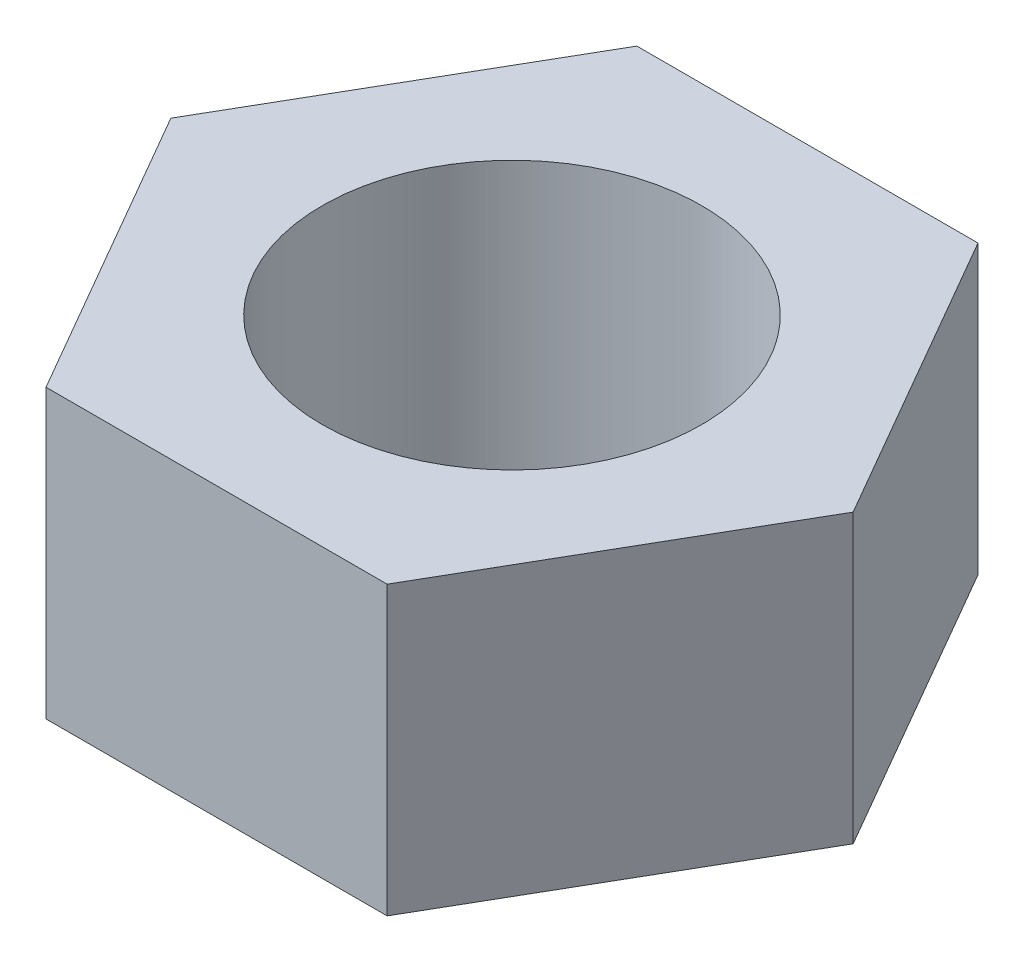
ISO-10303-21;
HEADER;
FILE_DESCRIPTION(('STEP AP214'),'2;1');
FILE_NAME('part.step','',(''),(''),'','','');
FILE_SCHEMA(('AUTOMOTIVE_DESIGN { 1 0 10303 214 1 1 1 1 }'));
ENDSEC;
DATA;
#1=APPLICATION_CONTEXT('core data for automotive mechanical design processes');
#2=APPLICATION_PROTOCOL_DEFINITION('international standard','automotive_design',2000,#1);
#3=PRODUCT_CONTEXT('',#1,'mechanical');
#4=PRODUCT('Part','Part','',(#3));
#5=PRODUCT_RELATED_PRODUCT_CATEGORY('part','',(#4));
#6=PRODUCT_DEFINITION_FORMATION('','',#4);
#7=PRODUCT_DEFINITION_CONTEXT('part definition',#1,'design');
#8=PRODUCT_DEFINITION('design','',#6,#7);
#9=PRODUCT_DEFINITION_SHAPE('','',#8);
#10=(LENGTH_UNIT() NAMED_UNIT(*) SI_UNIT(.MILLI.,.METRE.));
#11=(NAMED_UNIT(*) PLANE_ANGLE_UNIT() SI_UNIT($,.RADIAN.));
#12=(NAMED_UNIT(*) SI_UNIT($,.STERADIAN.) SOLID_ANGLE_UNIT());
#13=UNCERTAINTY_MEASURE_WITH_UNIT(LENGTH_MEASURE(1.E-05),#10,'distance_accuracy_value','');
#14=(GEOMETRIC_REPRESENTATION_CONTEXT(3) GLOBAL_UNCERTAINTY_ASSIGNED_CONTEXT((#13)) GLOBAL_UNIT_ASSIGNED_CONTEXT((#10,
#11,#12)) REPRESENTATION_CONTEXT('',''));
#15=CARTESIAN_POINT('',(0.,0.,0.));
#16=DIRECTION('',(0.,0.,1.));
#17=DIRECTION('',(1.,0.,0.));
#18=AXIS2_PLACEMENT_3D('',#15,#16,#17);
#19=CARTESIAN_POINT('',(0.,5.3,0.));
#20=DIRECTION('',(0.,1.,0.));
#21=DIRECTION('',(0.,0.,1.));
#22=AXIS2_PLACEMENT_3D('',#19,#20,#21);
#23=PLANE('',#22);
#24=DIRECTION('',(1.,0.,0.));
#25=VECTOR('',#24,1.);
#26=CARTESIAN_POINT('',(-3.14655896708346,5.3,5.45));
#27=LINE('',#26,#25);
#28=CARTESIAN_POINT('',(-3.14655896708346,5.3,5.45));
#29=VERTEX_POINT('',#28);
#30=CARTESIAN_POINT('',(3.14655896708346,5.3,5.45));
#31=VERTEX_POINT('',#30);
#32=EDGE_CURVE('E130',#29,#31,#27,.T.);
#33=ORIENTED_EDGE('',*,*,#32,.T.);
#34=DIRECTION('',(0.5,0.,-0.866025403784438));
#35=VECTOR('',#34,1.);
#36=CARTESIAN_POINT('',(3.14655896708346,5.3,5.45));
#37=LINE('',#36,#35);
#38=CARTESIAN_POINT('',(6.29311793416692,5.3,0.));
#39=VERTEX_POINT('',#38);
#40=EDGE_CURVE('E88',#31,#39,#37,.T.);
#41=ORIENTED_EDGE('',*,*,#40,.T.);
#42=DIRECTION('',(-0.5,0.,-0.866025403784438));
#43=VECTOR('',#42,1.);
#44=CARTESIAN_POINT('',(6.29311793416692,5.3,0.));
#45=LINE('',#44,#43);
#46=CARTESIAN_POINT('',(3.14655896708346,5.3,-5.45));
#47=VERTEX_POINT('',#46);
#48=EDGE_CURVE('E101',#39,#47,#45,.T.);
#49=ORIENTED_EDGE('',*,*,#48,.T.);
#50=DIRECTION('',(-1.,0.,0.));
#51=VECTOR('',#50,1.);
#52=CARTESIAN_POINT('',(3.14655896708346,5.3,-5.45));
#53=LINE('',#52,#51);
#54=CARTESIAN_POINT('',(-3.14655896708346,5.3,-5.45));
#55=VERTEX_POINT('',#54);
#56=EDGE_CURVE('E95',#47,#55,#53,.T.);
#57=ORIENTED_EDGE('',*,*,#56,.T.);
#58=DIRECTION('',(-0.5,0.,0.866025403784439));
#59=VECTOR('',#58,1.);
#60=CARTESIAN_POINT('',(-3.14655896708346,5.3,-5.45));
#61=LINE('',#60,#59);
#62=CARTESIAN_POINT('',(-6.29311793416692,5.3,0.));
#63=VERTEX_POINT('',#62);
#64=EDGE_CURVE('E99',#55,#63,#61,.T.);
#65=ORIENTED_EDGE('',*,*,#64,.T.);
#66=DIRECTION('',(0.5,0.,0.866025403784439));
#67=VECTOR('',#66,1.);
#68=CARTESIAN_POINT('',(-6.29311793416692,5.3,0.));
#69=LINE('',#68,#67);
#70=EDGE_CURVE('E51',#63,#29,#69,.T.);
#71=ORIENTED_EDGE('',*,*,#70,.T.);
#72=EDGE_LOOP('',(#33,#41,#49,#57,#65,#71));
#73=FACE_BOUND('',#72,.T.);
#74=CARTESIAN_POINT('',(0.,5.3,0.));
#75=DIRECTION('',(0.,1.,0.));
#76=DIRECTION('',(0.,0.,1.));
#77=AXIS2_PLACEMENT_3D('',#74,#75,#76);
#78=CIRCLE('',#77,3.5);
#79=CARTESIAN_POINT('',(0.,5.3,3.5));
#80=VERTEX_POINT('',#79);
#81=EDGE_CURVE('E123',#80,#80,#78,.T.);
#82=ORIENTED_EDGE('',*,*,#81,.F.);
#83=EDGE_LOOP('',(#82));
#84=FACE_BOUND('',#83,.T.);
#85=ADVANCED_FACE('F34',(#73,#84),#23,.T.);
#86=CARTESIAN_POINT('',(0.,0.,0.));
#87=DIRECTION('',(0.,1.,0.));
#88=DIRECTION('',(0.,0.,1.));
#89=AXIS2_PLACEMENT_3D('',#86,#87,#88);
#90=PLANE('',#89);
#91=DIRECTION('',(1.,0.,0.));
#92=VECTOR('',#91,1.);
#93=CARTESIAN_POINT('',(-3.14655896708346,0.,5.45));
#94=LINE('',#93,#92);
#95=CARTESIAN_POINT('',(-3.14655896708346,0.,5.45));
#96=VERTEX_POINT('',#95);
#97=CARTESIAN_POINT('',(3.14655896708346,0.,5.45));
#98=VERTEX_POINT('',#97);
#99=EDGE_CURVE('E119',#96,#98,#94,.T.);
#100=ORIENTED_EDGE('',*,*,#99,.F.);
#101=DIRECTION('',(0.5,0.,0.866025403784439));
#102=VECTOR('',#101,1.);
#103=CARTESIAN_POINT('',(-6.29311793416692,0.,0.));
#104=LINE('',#103,#102);
#105=CARTESIAN_POINT('',(-6.29311793416692,0.,0.));
#106=VERTEX_POINT('',#105);
#107=EDGE_CURVE('E80',#106,#96,#104,.T.);
#108=ORIENTED_EDGE('',*,*,#107,.F.);
#109=DIRECTION('',(-0.5,0.,0.866025403784439));
#110=VECTOR('',#109,1.);
#111=CARTESIAN_POINT('',(-3.14655896708346,0.,-5.45));
#112=LINE('',#111,#110);
#113=CARTESIAN_POINT('',(-3.14655896708346,0.,-5.45));
#114=VERTEX_POINT('',#113);
#115=EDGE_CURVE('E74',#114,#106,#112,.T.);
#116=ORIENTED_EDGE('',*,*,#115,.F.);
#117=DIRECTION('',(-1.,0.,0.));
#118=VECTOR('',#117,1.);
#119=CARTESIAN_POINT('',(3.14655896708346,0.,-5.45));
#120=LINE('',#119,#118);
#121=CARTESIAN_POINT('',(3.14655896708346,0.,-5.45));
#122=VERTEX_POINT('',#121);
#123=EDGE_CURVE('E109',#122,#114,#120,.T.);
#124=ORIENTED_EDGE('',*,*,#123,.F.);
#125=DIRECTION('',(-0.5,0.,-0.866025403784438));
#126=VECTOR('',#125,1.);
#127=CARTESIAN_POINT('',(6.29311793416692,0.,0.));
#128=LINE('',#127,#126);
#129=CARTESIAN_POINT('',(6.29311793416692,0.,0.));
#130=VERTEX_POINT('',#129);
#131=EDGE_CURVE('E125',#130,#122,#128,.T.);
#132=ORIENTED_EDGE('',*,*,#131,.F.);
#133=DIRECTION('',(0.5,0.,-0.866025403784438));
#134=VECTOR('',#133,1.);
#135=CARTESIAN_POINT('',(3.14655896708346,0.,5.45));
#136=LINE('',#135,#134);
#137=EDGE_CURVE('E122',#98,#130,#136,.T.);
#138=ORIENTED_EDGE('',*,*,#137,.F.);
#139=EDGE_LOOP('',(#100,#108,#116,#124,#132,#138));
#140=FACE_BOUND('',#139,.T.);
#141=CARTESIAN_POINT('',(0.,0.,0.));
#142=DIRECTION('',(0.,1.,0.));
#143=DIRECTION('',(0.,0.,1.));
#144=AXIS2_PLACEMENT_3D('',#141,#142,#143);
#145=CIRCLE('',#144,3.5);
#146=CARTESIAN_POINT('',(0.,0.,3.5));
#147=VERTEX_POINT('',#146);
#148=EDGE_CURVE('E223',#147,#147,#145,.T.);
#149=ORIENTED_EDGE('',*,*,#148,.T.);
#150=EDGE_LOOP('',(#149));
#151=FACE_BOUND('',#150,.T.);
#152=ADVANCED_FACE('F139',(#140,#151),#90,.F.);
#153=CARTESIAN_POINT('',(-3.14655896708346,5.3,5.45));
#154=DIRECTION('',(0.,0.,-1.));
#155=DIRECTION('',(-1.,0.,0.));
#156=AXIS2_PLACEMENT_3D('',#153,#154,#155);
#157=PLANE('',#156);
#158=ORIENTED_EDGE('',*,*,#99,.T.);
#159=DIRECTION('',(0.,-1.,0.));
#160=VECTOR('',#159,1.);
#161=CARTESIAN_POINT('',(3.14655896708346,5.3,5.45));
#162=LINE('',#161,#160);
#163=EDGE_CURVE('E11',#31,#98,#162,.T.);
#164=ORIENTED_EDGE('',*,*,#163,.F.);
#165=ORIENTED_EDGE('',*,*,#32,.F.);
#166=DIRECTION('',(0.,-1.,0.));
#167=VECTOR('',#166,1.);
#168=CARTESIAN_POINT('',(-3.14655896708346,5.3,5.45));
#169=LINE('',#168,#167);
#170=EDGE_CURVE('E115',#29,#96,#169,.T.);
#171=ORIENTED_EDGE('',*,*,#170,.T.);
#172=EDGE_LOOP('',(#158,#164,#165,#171));
#173=FACE_BOUND('',#172,.T.);
#174=ADVANCED_FACE('F36',(#173),#157,.F.);
#175=CARTESIAN_POINT('',(3.14655896708346,5.3,5.45));
#176=DIRECTION('',(-0.866025403784439,0.,-0.5));
#177=DIRECTION('',(-0.5,0.,0.866025403784439));
#178=AXIS2_PLACEMENT_3D('',#175,#176,#177);
#179=PLANE('',#178);
#180=ORIENTED_EDGE('',*,*,#137,.T.);
#181=DIRECTION('',(0.,-1.,0.));
#182=VECTOR('',#181,1.);
#183=CARTESIAN_POINT('',(6.29311793416692,5.3,0.));
#184=LINE('',#183,#182);
#185=EDGE_CURVE('E43',#39,#130,#184,.T.);
#186=ORIENTED_EDGE('',*,*,#185,.F.);
#187=ORIENTED_EDGE('',*,*,#40,.F.);
#188=ORIENTED_EDGE('',*,*,#163,.T.);
#189=EDGE_LOOP('',(#180,#186,#187,#188));
#190=FACE_BOUND('',#189,.T.);
#191=ADVANCED_FACE('F164',(#190),#179,.F.);
#192=CARTESIAN_POINT('',(6.29311793416692,5.3,0.));
#193=DIRECTION('',(-0.866025403784438,0.,0.5));
#194=DIRECTION('',(0.5,0.,0.866025403784438));
#195=AXIS2_PLACEMENT_3D('',#192,#193,#194);
#196=PLANE('',#195);
#197=ORIENTED_EDGE('',*,*,#131,.T.);
#198=DIRECTION('',(0.,-1.,0.));
#199=VECTOR('',#198,1.);
#200=CARTESIAN_POINT('',(3.14655896708346,5.3,-5.45));
#201=LINE('',#200,#199);
#202=EDGE_CURVE('E110',#47,#122,#201,.T.);
#203=ORIENTED_EDGE('',*,*,#202,.F.);
#204=ORIENTED_EDGE('',*,*,#48,.F.);
#205=ORIENTED_EDGE('',*,*,#185,.T.);
#206=EDGE_LOOP('',(#197,#203,#204,#205));
#207=FACE_BOUND('',#206,.T.);
#208=ADVANCED_FACE('F136',(#207),#196,.F.);
#209=CARTESIAN_POINT('',(3.14655896708346,5.3,-5.45));
#210=DIRECTION('',(0.,0.,1.));
#211=DIRECTION('',(1.,0.,0.));
#212=AXIS2_PLACEMENT_3D('',#209,#210,#211);
#213=PLANE('',#212);
#214=ORIENTED_EDGE('',*,*,#123,.T.);
#215=DIRECTION('',(0.,-1.,0.));
#216=VECTOR('',#215,1.);
#217=CARTESIAN_POINT('',(-3.14655896708346,5.3,-5.45));
#218=LINE('',#217,#216);
#219=EDGE_CURVE('E106',#55,#114,#218,.T.);
#220=ORIENTED_EDGE('',*,*,#219,.F.);
#221=ORIENTED_EDGE('',*,*,#56,.F.);
#222=ORIENTED_EDGE('',*,*,#202,.T.);
#223=EDGE_LOOP('',(#214,#220,#221,#222));
#224=FACE_BOUND('',#223,.T.);
#225=ADVANCED_FACE('F107',(#224),#213,.F.);
#226=CARTESIAN_POINT('',(-3.14655896708346,5.3,-5.45));
#227=DIRECTION('',(0.866025403784439,0.,0.5));
#228=DIRECTION('',(0.5,0.,-0.866025403784439));
#229=AXIS2_PLACEMENT_3D('',#226,#227,#228);
#230=PLANE('',#229);
#231=ORIENTED_EDGE('',*,*,#115,.T.);
#232=DIRECTION('',(0.,-1.,0.));
#233=VECTOR('',#232,1.);
#234=CARTESIAN_POINT('',(-6.29311793416692,5.3,0.));
#235=LINE('',#234,#233);
#236=EDGE_CURVE('E111',#63,#106,#235,.T.);
#237=ORIENTED_EDGE('',*,*,#236,.F.);
#238=ORIENTED_EDGE('',*,*,#64,.F.);
#239=ORIENTED_EDGE('',*,*,#219,.T.);
#240=EDGE_LOOP('',(#231,#237,#238,#239));
#241=FACE_BOUND('',#240,.T.);
#242=ADVANCED_FACE('F113',(#241),#230,.F.);
#243=CARTESIAN_POINT('',(-6.29311793416692,5.3,0.));
#244=DIRECTION('',(0.866025403784438,0.,-0.5));
#245=DIRECTION('',(-0.5,0.,-0.866025403784439));
#246=AXIS2_PLACEMENT_3D('',#243,#244,#245);
#247=PLANE('',#246);
#248=ORIENTED_EDGE('',*,*,#107,.T.);
#249=ORIENTED_EDGE('',*,*,#170,.F.);
#250=ORIENTED_EDGE('',*,*,#70,.F.);
#251=ORIENTED_EDGE('',*,*,#236,.T.);
#252=EDGE_LOOP('',(#248,#249,#250,#251));
#253=FACE_BOUND('',#252,.T.);
#254=ADVANCED_FACE('F144',(#253),#247,.F.);
#255=CARTESIAN_POINT('',(0.,5.3,0.));
#256=DIRECTION('',(0.,-1.,0.));
#257=DIRECTION('',(0.,0.,-1.));
#258=AXIS2_PLACEMENT_3D('',#255,#256,#257);
#259=CYLINDRICAL_SURFACE('',#258,3.5);
#260=ORIENTED_EDGE('',*,*,#81,.T.);
#261=EDGE_LOOP('',(#260));
#262=FACE_BOUND('',#261,.T.);
#263=ORIENTED_EDGE('',*,*,#148,.F.);
#264=EDGE_LOOP('',(#263));
#265=FACE_BOUND('',#264,.T.);
#266=ADVANCED_FACE('F146',(#262,#265),#259,.F.);
#267=CLOSED_SHELL('',(#85,#152,#174,#191,#208,#225,#242,#254,#266));
#268=MANIFOLD_SOLID_BREP('B2',#267);
#269=ADVANCED_BREP_SHAPE_REPRESENTATION('',(#18,#268),#14);
#270=SHAPE_DEFINITION_REPRESENTATION(#9,#269);
ENDSEC;
END-ISO-10303-21;
